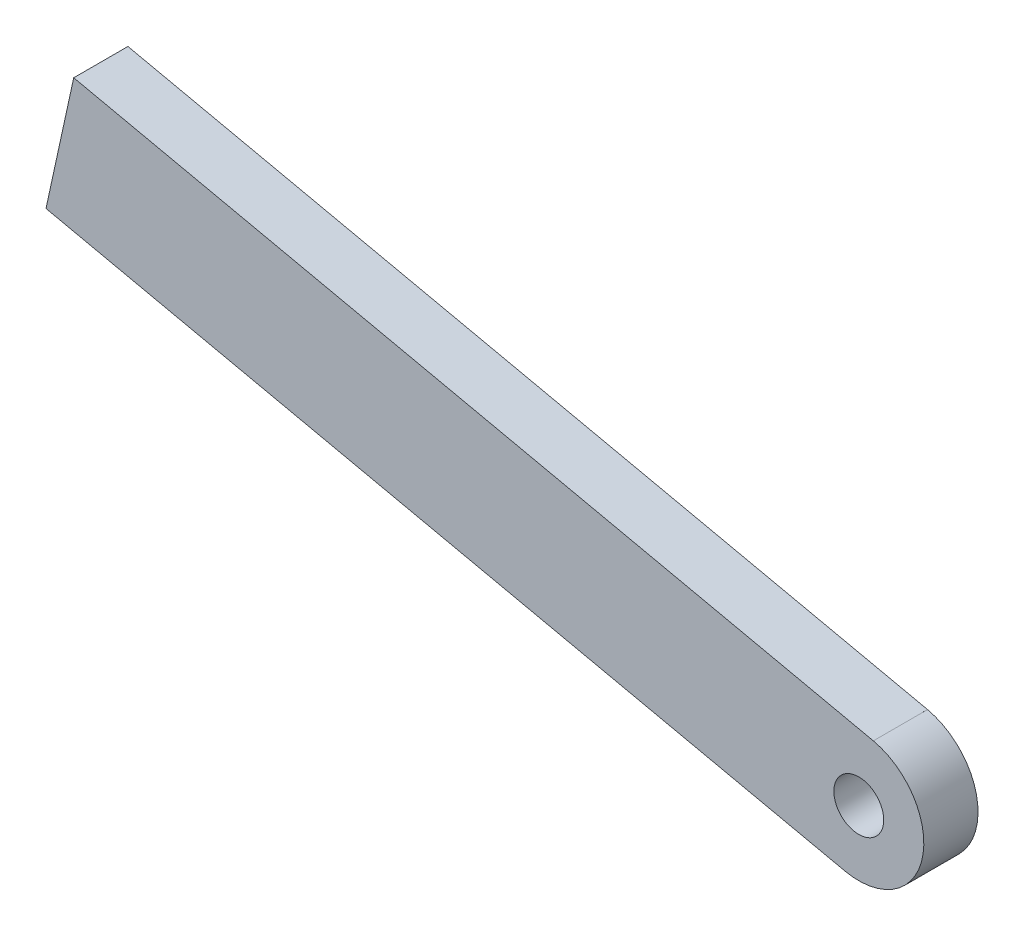
ISO-10303-21;
HEADER;
FILE_DESCRIPTION(('STEP AP214'),'2;1');
FILE_NAME('part.step','',(''),(''),'','','');
FILE_SCHEMA(('AUTOMOTIVE_DESIGN { 1 0 10303 214 1 1 1 1 }'));
ENDSEC;
DATA;
#1=APPLICATION_CONTEXT('core data for automotive mechanical design processes');
#2=APPLICATION_PROTOCOL_DEFINITION('international standard','automotive_design',2000,#1);
#3=PRODUCT_CONTEXT('',#1,'mechanical');
#4=PRODUCT('Part','Part','',(#3));
#5=PRODUCT_RELATED_PRODUCT_CATEGORY('part','',(#4));
#6=PRODUCT_DEFINITION_FORMATION('','',#4);
#7=PRODUCT_DEFINITION_CONTEXT('part definition',#1,'design');
#8=PRODUCT_DEFINITION('design','',#6,#7);
#9=PRODUCT_DEFINITION_SHAPE('','',#8);
#10=(LENGTH_UNIT() NAMED_UNIT(*) SI_UNIT(.MILLI.,.METRE.));
#11=(NAMED_UNIT(*) PLANE_ANGLE_UNIT() SI_UNIT($,.RADIAN.));
#12=(NAMED_UNIT(*) SI_UNIT($,.STERADIAN.) SOLID_ANGLE_UNIT());
#13=UNCERTAINTY_MEASURE_WITH_UNIT(LENGTH_MEASURE(1.E-05),#10,'distance_accuracy_value','');
#14=(GEOMETRIC_REPRESENTATION_CONTEXT(3) GLOBAL_UNCERTAINTY_ASSIGNED_CONTEXT((#13)) GLOBAL_UNIT_ASSIGNED_CONTEXT((#10,
#11,#12)) REPRESENTATION_CONTEXT('',''));
#15=CARTESIAN_POINT('',(0.,0.,0.));
#16=DIRECTION('',(0.,0.,1.));
#17=DIRECTION('',(1.,0.,0.));
#18=AXIS2_PLACEMENT_3D('',#15,#16,#17);
#19=CARTESIAN_POINT('',(-193.675,14.2875,3.175));
#20=DIRECTION('',(0.,0.,-1.));
#21=DIRECTION('',(-1.,0.,0.));
#22=AXIS2_PLACEMENT_3D('',#19,#20,#21);
#23=CYLINDRICAL_SURFACE('',#22,3.81000000034299);
#24=CARTESIAN_POINT('',(-193.675,14.2875,3.175));
#25=DIRECTION('',(0.,0.,1.));
#26=DIRECTION('',(1.,0.,0.));
#27=AXIS2_PLACEMENT_3D('',#24,#25,#26);
#28=CIRCLE('',#27,3.81000000034299);
#29=CARTESIAN_POINT('',(-194.446232662355,10.5563741400041,3.175));
#30=VERTEX_POINT('',#29);
#31=CARTESIAN_POINT('',(-192.822136520786,18.0008171004423,3.175));
#32=VERTEX_POINT('',#31);
#33=EDGE_CURVE('E140',#30,#32,#28,.T.);
#34=ORIENTED_EDGE('',*,*,#33,.F.);
#35=DIRECTION('',(0.,0.,-1.));
#36=VECTOR('',#35,1.);
#37=CARTESIAN_POINT('',(-194.446232662355,10.5563741400041,3.175));
#38=LINE('',#37,#36);
#39=CARTESIAN_POINT('',(-194.446232662355,10.5563741400041,0.));
#40=VERTEX_POINT('',#39);
#41=EDGE_CURVE('E12',#30,#40,#38,.T.);
#42=ORIENTED_EDGE('',*,*,#41,.T.);
#43=CARTESIAN_POINT('',(-193.675,14.2875,0.));
#44=DIRECTION('',(0.,0.,1.));
#45=DIRECTION('',(1.,0.,0.));
#46=AXIS2_PLACEMENT_3D('',#43,#44,#45);
#47=CIRCLE('',#46,3.81000000034299);
#48=CARTESIAN_POINT('',(-192.822136520786,18.0008171004423,0.));
#49=VERTEX_POINT('',#48);
#50=EDGE_CURVE('E139',#40,#49,#47,.T.);
#51=ORIENTED_EDGE('',*,*,#50,.T.);
#52=DIRECTION('',(0.,0.,-1.));
#53=VECTOR('',#52,1.);
#54=CARTESIAN_POINT('',(-192.822136520786,18.0008171004423,3.175));
#55=LINE('',#54,#53);
#56=EDGE_CURVE('E63',#49,#32,#55,.F.);
#57=ORIENTED_EDGE('',*,*,#56,.T.);
#58=EDGE_LOOP('',(#34,#42,#51,#57));
#59=FACE_BOUND('',#58,.T.);
#60=ADVANCED_FACE('F54',(#59),#23,.T.);
#61=CARTESIAN_POINT('',(-193.675,14.2875,0.));
#62=DIRECTION('',(0.,0.,1.));
#63=DIRECTION('',(1.,0.,0.));
#64=AXIS2_PLACEMENT_3D('',#61,#62,#63);
#65=PLANE('',#64);
#66=CARTESIAN_POINT('',(-193.675,14.2875,0.));
#67=DIRECTION('',(0.,0.,1.));
#68=DIRECTION('',(1.,0.,0.));
#69=AXIS2_PLACEMENT_3D('',#66,#67,#68);
#70=CIRCLE('',#69,1.46049999989577);
#71=CARTESIAN_POINT('',(-192.214500000104,14.2875,0.));
#72=VERTEX_POINT('',#71);
#73=EDGE_CURVE('E121',#72,#72,#70,.T.);
#74=ORIENTED_EDGE('',*,*,#73,.T.);
#75=EDGE_LOOP('',(#74));
#76=FACE_BOUND('',#75,.T.);
#77=ORIENTED_EDGE('',*,*,#50,.F.);
#78=DIRECTION('',(-0.213148789764074,-0.977019750784042,0.));
#79=VECTOR('',#78,1.);
#80=CARTESIAN_POINT('',(-192.822087702383,18.0010408715645,0.));
#81=LINE('',#80,#79);
#82=CARTESIAN_POINT('',(-194.446281480386,10.5561503705901,0.));
#83=VERTEX_POINT('',#82);
#84=EDGE_CURVE('E130',#40,#83,#81,.T.);
#85=ORIENTED_EDGE('',*,*,#84,.T.);
#86=DIRECTION('',(0.977019750784042,-0.213148789764074,0.));
#87=VECTOR('',#86,1.);
#88=CARTESIAN_POINT('',(-241.287043977709,20.7750347175226,0.));
#89=LINE('',#88,#87);
#90=CARTESIAN_POINT('',(-241.287043977709,20.7750347175226,0.));
#91=VERTEX_POINT('',#90);
#92=EDGE_CURVE('E119',#91,#83,#89,.T.);
#93=ORIENTED_EDGE('',*,*,#92,.F.);
#94=DIRECTION('',(-0.213148789764074,-0.977019750784042,0.));
#95=VECTOR('',#94,1.);
#96=CARTESIAN_POINT('',(-239.662850199707,28.219925218497,0.));
#97=LINE('',#96,#95);
#98=CARTESIAN_POINT('',(-239.662850199707,28.219925218497,0.));
#99=VERTEX_POINT('',#98);
#100=EDGE_CURVE('E108',#99,#91,#97,.T.);
#101=ORIENTED_EDGE('',*,*,#100,.F.);
#102=DIRECTION('',(0.977019750784042,-0.213148789764074,0.));
#103=VECTOR('',#102,1.);
#104=CARTESIAN_POINT('',(-239.662850199707,28.219925218497,0.));
#105=LINE('',#104,#103);
#106=CARTESIAN_POINT('',(-192.822087702383,18.0010408715645,0.));
#107=VERTEX_POINT('',#106);
#108=EDGE_CURVE('E100',#99,#107,#105,.T.);
#109=ORIENTED_EDGE('',*,*,#108,.T.);
#110=EDGE_CURVE('E126',#107,#49,#81,.T.);
#111=ORIENTED_EDGE('',*,*,#110,.T.);
#112=EDGE_LOOP('',(#77,#85,#93,#101,#109,#111));
#113=FACE_BOUND('',#112,.T.);
#114=ADVANCED_FACE('F117',(#76,#113),#65,.F.);
#115=CARTESIAN_POINT('',(-193.675,14.2875,3.175));
#116=DIRECTION('',(0.,0.,1.));
#117=DIRECTION('',(1.,0.,0.));
#118=AXIS2_PLACEMENT_3D('',#115,#116,#117);
#119=PLANE('',#118);
#120=CARTESIAN_POINT('',(-193.675,14.2875,3.175));
#121=DIRECTION('',(0.,0.,1.));
#122=DIRECTION('',(1.,0.,0.));
#123=AXIS2_PLACEMENT_3D('',#120,#121,#122);
#124=CIRCLE('',#123,1.46049999989577);
#125=CARTESIAN_POINT('',(-192.214500000104,14.2875,3.175));
#126=VERTEX_POINT('',#125);
#127=EDGE_CURVE('E152',#126,#126,#124,.T.);
#128=ORIENTED_EDGE('',*,*,#127,.F.);
#129=EDGE_LOOP('',(#128));
#130=FACE_BOUND('',#129,.T.);
#131=ORIENTED_EDGE('',*,*,#33,.T.);
#132=DIRECTION('',(-0.213148789764074,-0.977019750784042,0.));
#133=VECTOR('',#132,1.);
#134=CARTESIAN_POINT('',(-192.822087702383,18.0010408715645,3.175));
#135=LINE('',#134,#133);
#136=CARTESIAN_POINT('',(-192.822087702383,18.0010408715645,3.175));
#137=VERTEX_POINT('',#136);
#138=EDGE_CURVE('E157',#137,#32,#135,.T.);
#139=ORIENTED_EDGE('',*,*,#138,.F.);
#140=DIRECTION('',(0.977019750784042,-0.213148789764074,0.));
#141=VECTOR('',#140,1.);
#142=CARTESIAN_POINT('',(-239.662850199707,28.219925218497,3.175));
#143=LINE('',#142,#141);
#144=CARTESIAN_POINT('',(-239.662850199707,28.219925218497,3.175));
#145=VERTEX_POINT('',#144);
#146=EDGE_CURVE('E114',#145,#137,#143,.T.);
#147=ORIENTED_EDGE('',*,*,#146,.F.);
#148=DIRECTION('',(-0.213148789764074,-0.977019750784042,0.));
#149=VECTOR('',#148,1.);
#150=CARTESIAN_POINT('',(-239.662850199707,28.219925218497,3.175));
#151=LINE('',#150,#149);
#152=CARTESIAN_POINT('',(-241.287043977709,20.7750347175226,3.175));
#153=VERTEX_POINT('',#152);
#154=EDGE_CURVE('E110',#145,#153,#151,.T.);
#155=ORIENTED_EDGE('',*,*,#154,.T.);
#156=DIRECTION('',(0.977019750784042,-0.213148789764074,0.));
#157=VECTOR('',#156,1.);
#158=CARTESIAN_POINT('',(-241.287043977709,20.7750347175226,3.175));
#159=LINE('',#158,#157);
#160=CARTESIAN_POINT('',(-194.446281480386,10.5561503705901,3.175));
#161=VERTEX_POINT('',#160);
#162=EDGE_CURVE('E128',#153,#161,#159,.T.);
#163=ORIENTED_EDGE('',*,*,#162,.T.);
#164=EDGE_CURVE('E156',#30,#161,#135,.T.);
#165=ORIENTED_EDGE('',*,*,#164,.F.);
#166=EDGE_LOOP('',(#131,#139,#147,#155,#163,#165));
#167=FACE_BOUND('',#166,.T.);
#168=ADVANCED_FACE('F163',(#130,#167),#119,.T.);
#169=CARTESIAN_POINT('',(-192.822087702383,18.0010408715645,3.175));
#170=DIRECTION('',(0.977019750784042,-0.213148789764074,0.));
#171=DIRECTION('',(0.213148789764074,0.977019750784042,0.));
#172=AXIS2_PLACEMENT_3D('',#169,#170,#171);
#173=PLANE('',#172);
#174=ORIENTED_EDGE('',*,*,#41,.F.);
#175=ORIENTED_EDGE('',*,*,#164,.T.);
#176=DIRECTION('',(0.,0.,-1.));
#177=VECTOR('',#176,1.);
#178=CARTESIAN_POINT('',(-194.446281480386,10.5561503705901,3.175));
#179=LINE('',#178,#177);
#180=EDGE_CURVE('E135',#161,#83,#179,.T.);
#181=ORIENTED_EDGE('',*,*,#180,.T.);
#182=ORIENTED_EDGE('',*,*,#84,.F.);
#183=EDGE_LOOP('',(#174,#175,#181,#182));
#184=FACE_BOUND('',#183,.T.);
#185=ADVANCED_FACE('F161',(#184),#173,.T.);
#186=CARTESIAN_POINT('',(-241.287043977709,20.7750347175226,3.175));
#187=DIRECTION('',(0.213148789764074,0.977019750784042,0.));
#188=DIRECTION('',(-0.977019750784042,0.213148789764074,0.));
#189=AXIS2_PLACEMENT_3D('',#186,#187,#188);
#190=PLANE('',#189);
#191=ORIENTED_EDGE('',*,*,#180,.F.);
#192=ORIENTED_EDGE('',*,*,#162,.F.);
#193=DIRECTION('',(0.,0.,-1.));
#194=VECTOR('',#193,1.);
#195=CARTESIAN_POINT('',(-241.287043977709,20.7750347175226,3.175));
#196=LINE('',#195,#194);
#197=EDGE_CURVE('E138',#153,#91,#196,.T.);
#198=ORIENTED_EDGE('',*,*,#197,.T.);
#199=ORIENTED_EDGE('',*,*,#92,.T.);
#200=EDGE_LOOP('',(#191,#192,#198,#199));
#201=FACE_BOUND('',#200,.T.);
#202=ADVANCED_FACE('F162',(#201),#190,.F.);
#203=CARTESIAN_POINT('',(-239.662850199707,28.219925218497,3.175));
#204=DIRECTION('',(0.977019750784042,-0.213148789764074,0.));
#205=DIRECTION('',(0.213148789764074,0.977019750784042,0.));
#206=AXIS2_PLACEMENT_3D('',#203,#204,#205);
#207=PLANE('',#206);
#208=ORIENTED_EDGE('',*,*,#100,.T.);
#209=ORIENTED_EDGE('',*,*,#197,.F.);
#210=ORIENTED_EDGE('',*,*,#154,.F.);
#211=DIRECTION('',(0.,0.,-1.));
#212=VECTOR('',#211,1.);
#213=CARTESIAN_POINT('',(-239.662850199707,28.219925218497,3.175));
#214=LINE('',#213,#212);
#215=EDGE_CURVE('E106',#145,#99,#214,.T.);
#216=ORIENTED_EDGE('',*,*,#215,.T.);
#217=EDGE_LOOP('',(#208,#209,#210,#216));
#218=FACE_BOUND('',#217,.T.);
#219=ADVANCED_FACE('F56',(#218),#207,.F.);
#220=CARTESIAN_POINT('',(-239.662850199707,28.219925218497,3.175));
#221=DIRECTION('',(0.213148789764074,0.977019750784042,0.));
#222=DIRECTION('',(-0.977019750784042,0.213148789764074,0.));
#223=AXIS2_PLACEMENT_3D('',#220,#221,#222);
#224=PLANE('',#223);
#225=DIRECTION('',(0.,0.,-1.));
#226=VECTOR('',#225,1.);
#227=CARTESIAN_POINT('',(-192.822087702383,18.0010408715645,3.175));
#228=LINE('',#227,#226);
#229=EDGE_CURVE('E113',#137,#107,#228,.T.);
#230=ORIENTED_EDGE('',*,*,#229,.T.);
#231=ORIENTED_EDGE('',*,*,#108,.F.);
#232=ORIENTED_EDGE('',*,*,#215,.F.);
#233=ORIENTED_EDGE('',*,*,#146,.T.);
#234=EDGE_LOOP('',(#230,#231,#232,#233));
#235=FACE_BOUND('',#234,.T.);
#236=ADVANCED_FACE('F123',(#235),#224,.T.);
#237=ORIENTED_EDGE('',*,*,#56,.F.);
#238=ORIENTED_EDGE('',*,*,#110,.F.);
#239=ORIENTED_EDGE('',*,*,#229,.F.);
#240=ORIENTED_EDGE('',*,*,#138,.T.);
#241=EDGE_LOOP('',(#237,#238,#239,#240));
#242=FACE_BOUND('',#241,.T.);
#243=ADVANCED_FACE('F165',(#242),#173,.T.);
#244=CARTESIAN_POINT('',(-193.675,14.2875,0.));
#245=DIRECTION('',(0.,0.,1.));
#246=DIRECTION('',(1.,0.,0.));
#247=AXIS2_PLACEMENT_3D('',#244,#245,#246);
#248=CYLINDRICAL_SURFACE('',#247,1.46049999989577);
#249=ORIENTED_EDGE('',*,*,#73,.F.);
#250=EDGE_LOOP('',(#249));
#251=FACE_BOUND('',#250,.T.);
#252=ORIENTED_EDGE('',*,*,#127,.T.);
#253=EDGE_LOOP('',(#252));
#254=FACE_BOUND('',#253,.T.);
#255=ADVANCED_FACE('F179',(#251,#254),#248,.F.);
#256=CLOSED_SHELL('',(#60,#114,#168,#185,#202,#219,#236,#243,#255));
#257=MANIFOLD_SOLID_BREP('B2',#256);
#258=ADVANCED_BREP_SHAPE_REPRESENTATION('',(#18,#257),#14);
#259=SHAPE_DEFINITION_REPRESENTATION(#9,#258);
ENDSEC;
END-ISO-10303-21;
